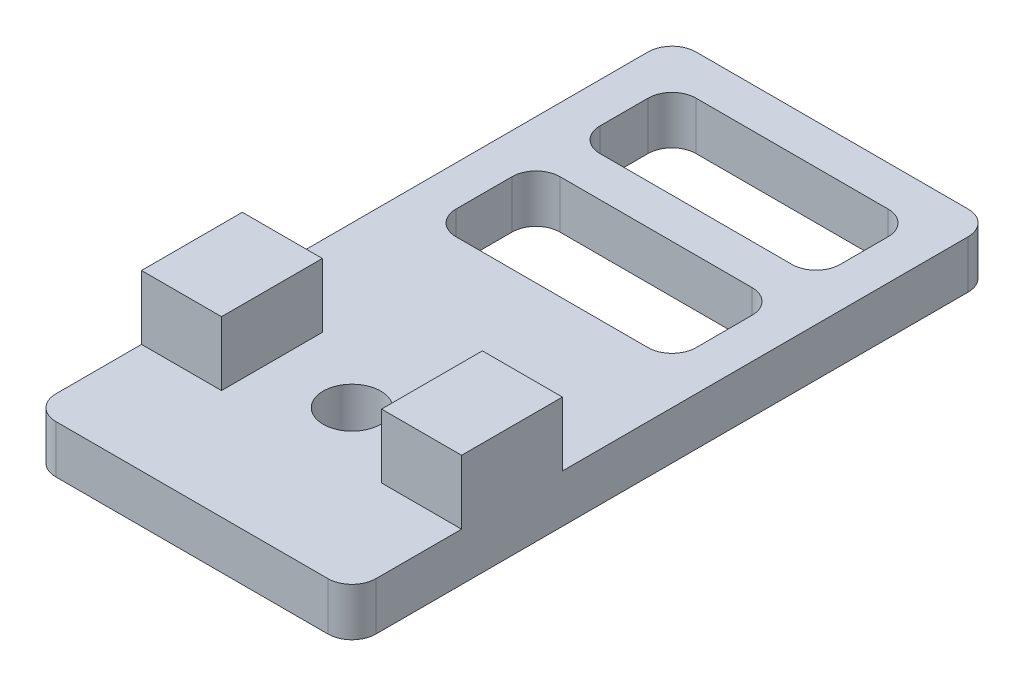
ISO-10303-21;
HEADER;
FILE_DESCRIPTION(('STEP AP214'),'2;1');
FILE_NAME('part.step','',(''),(''),'','','');
FILE_SCHEMA(('AUTOMOTIVE_DESIGN { 1 0 10303 214 1 1 1 1 }'));
ENDSEC;
DATA;
#1=APPLICATION_CONTEXT('core data for automotive mechanical design processes');
#2=APPLICATION_PROTOCOL_DEFINITION('international standard','automotive_design',2000,#1);
#3=PRODUCT_CONTEXT('',#1,'mechanical');
#4=PRODUCT('Part','Part','',(#3));
#5=PRODUCT_RELATED_PRODUCT_CATEGORY('part','',(#4));
#6=PRODUCT_DEFINITION_FORMATION('','',#4);
#7=PRODUCT_DEFINITION_CONTEXT('part definition',#1,'design');
#8=PRODUCT_DEFINITION('design','',#6,#7);
#9=PRODUCT_DEFINITION_SHAPE('','',#8);
#10=(LENGTH_UNIT() NAMED_UNIT(*) SI_UNIT(.MILLI.,.METRE.));
#11=(NAMED_UNIT(*) PLANE_ANGLE_UNIT() SI_UNIT($,.RADIAN.));
#12=(NAMED_UNIT(*) SI_UNIT($,.STERADIAN.) SOLID_ANGLE_UNIT());
#13=UNCERTAINTY_MEASURE_WITH_UNIT(LENGTH_MEASURE(1.E-05),#10,'distance_accuracy_value','');
#14=(GEOMETRIC_REPRESENTATION_CONTEXT(3) GLOBAL_UNCERTAINTY_ASSIGNED_CONTEXT((#13)) GLOBAL_UNIT_ASSIGNED_CONTEXT((#10,
#11,#12)) REPRESENTATION_CONTEXT('',''));
#15=CARTESIAN_POINT('',(0.,0.,0.));
#16=DIRECTION('',(0.,0.,1.));
#17=DIRECTION('',(1.,0.,0.));
#18=AXIS2_PLACEMENT_3D('',#15,#16,#17);
#19=CARTESIAN_POINT('',(17.5,3.,0.));
#20=DIRECTION('',(1.,0.,0.));
#21=DIRECTION('',(0.,0.,-1.));
#22=AXIS2_PLACEMENT_3D('',#19,#20,#21);
#23=PLANE('',#22);
#24=DIRECTION('',(0.,0.,1.));
#25=VECTOR('',#24,1.);
#26=CARTESIAN_POINT('',(17.5,0.,0.));
#27=LINE('',#26,#25);
#28=CARTESIAN_POINT('',(17.5,0.,-36.));
#29=VERTEX_POINT('',#28);
#30=CARTESIAN_POINT('',(17.5,0.,-33.));
#31=VERTEX_POINT('',#30);
#32=EDGE_CURVE('E395',#29,#31,#27,.T.);
#33=ORIENTED_EDGE('',*,*,#32,.T.);
#34=DIRECTION('',(0.,1.,0.));
#35=VECTOR('',#34,1.);
#36=CARTESIAN_POINT('',(17.5,3.,-33.));
#37=LINE('',#36,#35);
#38=CARTESIAN_POINT('',(17.5,3.,-33.));
#39=VERTEX_POINT('',#38);
#40=EDGE_CURVE('E436',#31,#39,#37,.T.);
#41=ORIENTED_EDGE('',*,*,#40,.T.);
#42=DIRECTION('',(0.,0.,1.));
#43=VECTOR('',#42,1.);
#44=CARTESIAN_POINT('',(17.5,3.,0.));
#45=LINE('',#44,#43);
#46=CARTESIAN_POINT('',(17.5,3.,-36.));
#47=VERTEX_POINT('',#46);
#48=EDGE_CURVE('E367',#47,#39,#45,.T.);
#49=ORIENTED_EDGE('',*,*,#48,.F.);
#50=DIRECTION('',(0.,-1.,0.));
#51=VECTOR('',#50,1.);
#52=CARTESIAN_POINT('',(17.5,0.,-36.));
#53=LINE('',#52,#51);
#54=EDGE_CURVE('E433',#47,#29,#53,.T.);
#55=ORIENTED_EDGE('',*,*,#54,.T.);
#56=EDGE_LOOP('',(#33,#41,#49,#55));
#57=FACE_BOUND('',#56,.T.);
#58=ADVANCED_FACE('F65',(#57),#23,.F.);
#59=CARTESIAN_POINT('',(17.5,3.,-27.5));
#60=VERTEX_POINT('',#59);
#61=CARTESIAN_POINT('',(17.5,3.,-24.));
#62=VERTEX_POINT('',#61);
#63=EDGE_CURVE('E366',#60,#62,#45,.T.);
#64=ORIENTED_EDGE('',*,*,#63,.F.);
#65=DIRECTION('',(0.,1.,0.));
#66=VECTOR('',#65,1.);
#67=CARTESIAN_POINT('',(17.5,0.,-27.5));
#68=LINE('',#67,#66);
#69=CARTESIAN_POINT('',(17.5,0.,-27.5));
#70=VERTEX_POINT('',#69);
#71=EDGE_CURVE('E431',#60,#70,#68,.F.);
#72=ORIENTED_EDGE('',*,*,#71,.T.);
#73=CARTESIAN_POINT('',(17.5,0.,-24.));
#74=VERTEX_POINT('',#73);
#75=EDGE_CURVE('E394',#70,#74,#27,.T.);
#76=ORIENTED_EDGE('',*,*,#75,.T.);
#77=DIRECTION('',(0.,-1.,0.));
#78=VECTOR('',#77,1.);
#79=CARTESIAN_POINT('',(17.5,3.,-24.));
#80=LINE('',#79,#78);
#81=EDGE_CURVE('E429',#74,#62,#80,.F.);
#82=ORIENTED_EDGE('',*,*,#81,.T.);
#83=EDGE_LOOP('',(#64,#72,#76,#82));
#84=FACE_BOUND('',#83,.T.);
#85=ADVANCED_FACE('F563',(#84),#23,.F.);
#86=CARTESIAN_POINT('',(0.,3.,-22.5));
#87=DIRECTION('',(0.,0.,-1.));
#88=DIRECTION('',(-1.,0.,0.));
#89=AXIS2_PLACEMENT_3D('',#86,#87,#88);
#90=PLANE('',#89);
#91=DIRECTION('',(1.,0.,0.));
#92=VECTOR('',#91,1.);
#93=CARTESIAN_POINT('',(0.,0.,-22.5));
#94=LINE('',#93,#92);
#95=CARTESIAN_POINT('',(4.,0.,-22.5));
#96=VERTEX_POINT('',#95);
#97=CARTESIAN_POINT('',(16.,0.,-22.5));
#98=VERTEX_POINT('',#97);
#99=EDGE_CURVE('E398',#96,#98,#94,.T.);
#100=ORIENTED_EDGE('',*,*,#99,.F.);
#101=DIRECTION('',(0.,-1.,0.));
#102=VECTOR('',#101,1.);
#103=CARTESIAN_POINT('',(4.,3.,-22.5));
#104=LINE('',#103,#102);
#105=CARTESIAN_POINT('',(4.,3.,-22.5));
#106=VERTEX_POINT('',#105);
#107=EDGE_CURVE('E422',#96,#106,#104,.F.);
#108=ORIENTED_EDGE('',*,*,#107,.T.);
#109=DIRECTION('',(1.,0.,0.));
#110=VECTOR('',#109,1.);
#111=CARTESIAN_POINT('',(0.,3.,-22.5));
#112=LINE('',#111,#110);
#113=CARTESIAN_POINT('',(16.,3.,-22.5));
#114=VERTEX_POINT('',#113);
#115=EDGE_CURVE('E370',#106,#114,#112,.T.);
#116=ORIENTED_EDGE('',*,*,#115,.T.);
#117=DIRECTION('',(0.,-1.,0.));
#118=VECTOR('',#117,1.);
#119=CARTESIAN_POINT('',(16.,3.,-22.5));
#120=LINE('',#119,#118);
#121=EDGE_CURVE('E419',#114,#98,#120,.T.);
#122=ORIENTED_EDGE('',*,*,#121,.T.);
#123=EDGE_LOOP('',(#100,#108,#116,#122));
#124=FACE_BOUND('',#123,.T.);
#125=ADVANCED_FACE('F569',(#124),#90,.T.);
#126=CARTESIAN_POINT('',(2.5,3.,0.));
#127=DIRECTION('',(1.,0.,0.));
#128=DIRECTION('',(0.,0.,-1.));
#129=AXIS2_PLACEMENT_3D('',#126,#127,#128);
#130=PLANE('',#129);
#131=DIRECTION('',(0.,0.,1.));
#132=VECTOR('',#131,1.);
#133=CARTESIAN_POINT('',(2.5,3.,0.));
#134=LINE('',#133,#132);
#135=CARTESIAN_POINT('',(2.5,3.,-27.5));
#136=VERTEX_POINT('',#135);
#137=CARTESIAN_POINT('',(2.5,3.,-24.));
#138=VERTEX_POINT('',#137);
#139=EDGE_CURVE('E373',#136,#138,#134,.T.);
#140=ORIENTED_EDGE('',*,*,#139,.T.);
#141=DIRECTION('',(0.,-1.,0.));
#142=VECTOR('',#141,1.);
#143=CARTESIAN_POINT('',(2.5,0.,-24.));
#144=LINE('',#143,#142);
#145=CARTESIAN_POINT('',(2.5,0.,-24.));
#146=VERTEX_POINT('',#145);
#147=EDGE_CURVE('E416',#138,#146,#144,.T.);
#148=ORIENTED_EDGE('',*,*,#147,.T.);
#149=DIRECTION('',(0.,0.,1.));
#150=VECTOR('',#149,1.);
#151=CARTESIAN_POINT('',(2.5,0.,0.));
#152=LINE('',#151,#150);
#153=CARTESIAN_POINT('',(2.5,0.,-27.5));
#154=VERTEX_POINT('',#153);
#155=EDGE_CURVE('E401',#154,#146,#152,.T.);
#156=ORIENTED_EDGE('',*,*,#155,.F.);
#157=DIRECTION('',(0.,1.,0.));
#158=VECTOR('',#157,1.);
#159=CARTESIAN_POINT('',(2.5,3.,-27.5));
#160=LINE('',#159,#158);
#161=EDGE_CURVE('E377',#154,#136,#160,.T.);
#162=ORIENTED_EDGE('',*,*,#161,.T.);
#163=EDGE_LOOP('',(#140,#148,#156,#162));
#164=FACE_BOUND('',#163,.T.);
#165=ADVANCED_FACE('F729',(#164),#130,.T.);
#166=CARTESIAN_POINT('',(2.5,3.,-36.));
#167=VERTEX_POINT('',#166);
#168=CARTESIAN_POINT('',(2.5,3.,-33.));
#169=VERTEX_POINT('',#168);
#170=EDGE_CURVE('E374',#167,#169,#134,.T.);
#171=ORIENTED_EDGE('',*,*,#170,.T.);
#172=DIRECTION('',(0.,1.,0.));
#173=VECTOR('',#172,1.);
#174=CARTESIAN_POINT('',(2.5,0.,-33.));
#175=LINE('',#174,#173);
#176=CARTESIAN_POINT('',(2.5,0.,-33.));
#177=VERTEX_POINT('',#176);
#178=EDGE_CURVE('E446',#169,#177,#175,.F.);
#179=ORIENTED_EDGE('',*,*,#178,.T.);
#180=CARTESIAN_POINT('',(2.5,0.,-36.));
#181=VERTEX_POINT('',#180);
#182=EDGE_CURVE('E354',#181,#177,#152,.T.);
#183=ORIENTED_EDGE('',*,*,#182,.F.);
#184=DIRECTION('',(0.,-1.,0.));
#185=VECTOR('',#184,1.);
#186=CARTESIAN_POINT('',(2.5,3.,-36.));
#187=LINE('',#186,#185);
#188=EDGE_CURVE('E444',#181,#167,#187,.F.);
#189=ORIENTED_EDGE('',*,*,#188,.T.);
#190=EDGE_LOOP('',(#171,#179,#183,#189));
#191=FACE_BOUND('',#190,.T.);
#192=ADVANCED_FACE('F548',(#191),#130,.T.);
#193=CARTESIAN_POINT('',(0.,3.,-37.5));
#194=DIRECTION('',(0.,0.,-1.));
#195=DIRECTION('',(-1.,0.,0.));
#196=AXIS2_PLACEMENT_3D('',#193,#194,#195);
#197=PLANE('',#196);
#198=DIRECTION('',(1.,0.,0.));
#199=VECTOR('',#198,1.);
#200=CARTESIAN_POINT('',(0.,3.,-37.5));
#201=LINE('',#200,#199);
#202=CARTESIAN_POINT('',(4.,3.,-37.5));
#203=VERTEX_POINT('',#202);
#204=CARTESIAN_POINT('',(16.,3.,-37.5));
#205=VERTEX_POINT('',#204);
#206=EDGE_CURVE('E363',#203,#205,#201,.T.);
#207=ORIENTED_EDGE('',*,*,#206,.F.);
#208=DIRECTION('',(0.,-1.,0.));
#209=VECTOR('',#208,1.);
#210=CARTESIAN_POINT('',(4.,3.,-37.5));
#211=LINE('',#210,#209);
#212=CARTESIAN_POINT('',(4.,0.,-37.5));
#213=VERTEX_POINT('',#212);
#214=EDGE_CURVE('E450',#203,#213,#211,.T.);
#215=ORIENTED_EDGE('',*,*,#214,.T.);
#216=DIRECTION('',(1.,0.,0.));
#217=VECTOR('',#216,1.);
#218=CARTESIAN_POINT('',(0.,0.,-37.5));
#219=LINE('',#218,#217);
#220=CARTESIAN_POINT('',(16.,0.,-37.5));
#221=VERTEX_POINT('',#220);
#222=EDGE_CURVE('E391',#213,#221,#219,.T.);
#223=ORIENTED_EDGE('',*,*,#222,.T.);
#224=DIRECTION('',(0.,-1.,0.));
#225=VECTOR('',#224,1.);
#226=CARTESIAN_POINT('',(16.,3.,-37.5));
#227=LINE('',#226,#225);
#228=EDGE_CURVE('E448',#221,#205,#227,.F.);
#229=ORIENTED_EDGE('',*,*,#228,.T.);
#230=EDGE_LOOP('',(#207,#215,#223,#229));
#231=FACE_BOUND('',#230,.T.);
#232=ADVANCED_FACE('F523',(#231),#197,.F.);
#233=CARTESIAN_POINT('',(20.,3.,0.));
#234=DIRECTION('',(-1.,0.,0.));
#235=DIRECTION('',(0.,0.,1.));
#236=AXIS2_PLACEMENT_3D('',#233,#234,#235);
#237=PLANE('',#236);
#238=DIRECTION('',(0.,0.,-1.));
#239=VECTOR('',#238,1.);
#240=CARTESIAN_POINT('',(20.,3.,0.));
#241=LINE('',#240,#239);
#242=CARTESIAN_POINT('',(20.,3.,-1.5));
#243=VERTEX_POINT('',#242);
#244=CARTESIAN_POINT('',(20.,3.,-6.85));
#245=VERTEX_POINT('',#244);
#246=EDGE_CURVE('E355',#243,#245,#241,.T.);
#247=ORIENTED_EDGE('',*,*,#246,.F.);
#248=DIRECTION('',(0.,-1.,0.));
#249=VECTOR('',#248,1.);
#250=CARTESIAN_POINT('',(20.,3.,-1.5));
#251=LINE('',#250,#249);
#252=CARTESIAN_POINT('',(20.,0.,-1.5));
#253=VERTEX_POINT('',#252);
#254=EDGE_CURVE('E455',#243,#253,#251,.T.);
#255=ORIENTED_EDGE('',*,*,#254,.T.);
#256=DIRECTION('',(0.,0.,-1.));
#257=VECTOR('',#256,1.);
#258=CARTESIAN_POINT('',(20.,0.,0.));
#259=LINE('',#258,#257);
#260=CARTESIAN_POINT('',(20.,0.,-38.5));
#261=VERTEX_POINT('',#260);
#262=EDGE_CURVE('E381',#253,#261,#259,.T.);
#263=ORIENTED_EDGE('',*,*,#262,.T.);
#264=DIRECTION('',(0.,-1.,0.));
#265=VECTOR('',#264,1.);
#266=CARTESIAN_POINT('',(20.,3.,-38.5));
#267=LINE('',#266,#265);
#268=CARTESIAN_POINT('',(20.,3.,-38.5));
#269=VERTEX_POINT('',#268);
#270=EDGE_CURVE('E453',#261,#269,#267,.F.);
#271=ORIENTED_EDGE('',*,*,#270,.T.);
#272=CARTESIAN_POINT('',(20.,3.,-13.15));
#273=VERTEX_POINT('',#272);
#274=EDGE_CURVE('E353',#273,#269,#241,.T.);
#275=ORIENTED_EDGE('',*,*,#274,.F.);
#276=DIRECTION('',(0.,-1.,0.));
#277=VECTOR('',#276,1.);
#278=CARTESIAN_POINT('',(20.,7.,-13.15));
#279=LINE('',#278,#277);
#280=CARTESIAN_POINT('',(20.,7.,-13.15));
#281=VERTEX_POINT('',#280);
#282=EDGE_CURVE('E313',#281,#273,#279,.T.);
#283=ORIENTED_EDGE('',*,*,#282,.F.);
#284=DIRECTION('',(0.,0.,-1.));
#285=VECTOR('',#284,1.);
#286=CARTESIAN_POINT('',(20.,7.,0.));
#287=LINE('',#286,#285);
#288=CARTESIAN_POINT('',(20.,7.,-6.85));
#289=VERTEX_POINT('',#288);
#290=EDGE_CURVE('E300',#289,#281,#287,.T.);
#291=ORIENTED_EDGE('',*,*,#290,.F.);
#292=DIRECTION('',(0.,-1.,0.));
#293=VECTOR('',#292,1.);
#294=CARTESIAN_POINT('',(20.,7.,-6.85));
#295=LINE('',#294,#293);
#296=EDGE_CURVE('E317',#289,#245,#295,.T.);
#297=ORIENTED_EDGE('',*,*,#296,.T.);
#298=EDGE_LOOP('',(#247,#255,#263,#271,#275,#283,#291,#297));
#299=FACE_BOUND('',#298,.T.);
#300=ADVANCED_FACE('F576',(#299),#237,.F.);
#301=CARTESIAN_POINT('',(0.,3.,-40.));
#302=DIRECTION('',(0.,0.,-1.));
#303=DIRECTION('',(-1.,0.,0.));
#304=AXIS2_PLACEMENT_3D('',#301,#302,#303);
#305=PLANE('',#304);
#306=DIRECTION('',(1.,0.,0.));
#307=VECTOR('',#306,1.);
#308=CARTESIAN_POINT('',(0.,0.,-40.));
#309=LINE('',#308,#307);
#310=CARTESIAN_POINT('',(1.49999999999999,0.,-40.));
#311=VERTEX_POINT('',#310);
#312=CARTESIAN_POINT('',(18.5,0.,-40.));
#313=VERTEX_POINT('',#312);
#314=EDGE_CURVE('E385',#311,#313,#309,.T.);
#315=ORIENTED_EDGE('',*,*,#314,.F.);
#316=DIRECTION('',(0.,-1.,0.));
#317=VECTOR('',#316,1.);
#318=CARTESIAN_POINT('',(1.49999999999999,3.,-40.));
#319=LINE('',#318,#317);
#320=CARTESIAN_POINT('',(1.49999999999999,3.,-40.));
#321=VERTEX_POINT('',#320);
#322=EDGE_CURVE('E485',#311,#321,#319,.F.);
#323=ORIENTED_EDGE('',*,*,#322,.T.);
#324=DIRECTION('',(1.,0.,0.));
#325=VECTOR('',#324,1.);
#326=CARTESIAN_POINT('',(0.,3.,-40.));
#327=LINE('',#326,#325);
#328=CARTESIAN_POINT('',(18.5,3.,-40.));
#329=VERTEX_POINT('',#328);
#330=EDGE_CURVE('E357',#321,#329,#327,.T.);
#331=ORIENTED_EDGE('',*,*,#330,.T.);
#332=DIRECTION('',(0.,-1.,0.));
#333=VECTOR('',#332,1.);
#334=CARTESIAN_POINT('',(18.5,0.,-40.));
#335=LINE('',#334,#333);
#336=EDGE_CURVE('E482',#329,#313,#335,.T.);
#337=ORIENTED_EDGE('',*,*,#336,.T.);
#338=EDGE_LOOP('',(#315,#323,#331,#337));
#339=FACE_BOUND('',#338,.T.);
#340=ADVANCED_FACE('F581',(#339),#305,.T.);
#341=CARTESIAN_POINT('',(0.,3.,0.));
#342=DIRECTION('',(-1.,0.,0.));
#343=DIRECTION('',(0.,0.,1.));
#344=AXIS2_PLACEMENT_3D('',#341,#342,#343);
#345=PLANE('',#344);
#346=DIRECTION('',(0.,0.,-1.));
#347=VECTOR('',#346,1.);
#348=CARTESIAN_POINT('',(0.,0.,0.));
#349=LINE('',#348,#347);
#350=CARTESIAN_POINT('',(0.,0.,-1.5));
#351=VERTEX_POINT('',#350);
#352=CARTESIAN_POINT('',(0.,0.,-38.5));
#353=VERTEX_POINT('',#352);
#354=EDGE_CURVE('E388',#351,#353,#349,.T.);
#355=ORIENTED_EDGE('',*,*,#354,.F.);
#356=DIRECTION('',(0.,-1.,0.));
#357=VECTOR('',#356,1.);
#358=CARTESIAN_POINT('',(0.,3.,-1.5));
#359=LINE('',#358,#357);
#360=CARTESIAN_POINT('',(0.,3.,-1.5));
#361=VERTEX_POINT('',#360);
#362=EDGE_CURVE('E80',#351,#361,#359,.F.);
#363=ORIENTED_EDGE('',*,*,#362,.T.);
#364=DIRECTION('',(0.,0.,-1.));
#365=VECTOR('',#364,1.);
#366=CARTESIAN_POINT('',(0.,3.,0.));
#367=LINE('',#366,#365);
#368=CARTESIAN_POINT('',(0.,3.,-6.85));
#369=VERTEX_POINT('',#368);
#370=EDGE_CURVE('E361',#361,#369,#367,.T.);
#371=ORIENTED_EDGE('',*,*,#370,.T.);
#372=DIRECTION('',(0.,-1.,0.));
#373=VECTOR('',#372,1.);
#374=CARTESIAN_POINT('',(0.,7.,-6.85));
#375=LINE('',#374,#373);
#376=CARTESIAN_POINT('',(0.,7.,-6.85));
#377=VERTEX_POINT('',#376);
#378=EDGE_CURVE('E341',#377,#369,#375,.T.);
#379=ORIENTED_EDGE('',*,*,#378,.F.);
#380=DIRECTION('',(0.,0.,1.));
#381=VECTOR('',#380,1.);
#382=CARTESIAN_POINT('',(0.,7.,0.));
#383=LINE('',#382,#381);
#384=CARTESIAN_POINT('',(0.,7.,-13.15));
#385=VERTEX_POINT('',#384);
#386=EDGE_CURVE('E328',#385,#377,#383,.T.);
#387=ORIENTED_EDGE('',*,*,#386,.F.);
#388=DIRECTION('',(0.,-1.,0.));
#389=VECTOR('',#388,1.);
#390=CARTESIAN_POINT('',(0.,7.,-13.15));
#391=LINE('',#390,#389);
#392=CARTESIAN_POINT('',(0.,3.,-13.15));
#393=VERTEX_POINT('',#392);
#394=EDGE_CURVE('E344',#385,#393,#391,.T.);
#395=ORIENTED_EDGE('',*,*,#394,.T.);
#396=CARTESIAN_POINT('',(0.,3.,-38.5));
#397=VERTEX_POINT('',#396);
#398=EDGE_CURVE('E360',#393,#397,#367,.T.);
#399=ORIENTED_EDGE('',*,*,#398,.T.);
#400=DIRECTION('',(0.,-1.,0.));
#401=VECTOR('',#400,1.);
#402=CARTESIAN_POINT('',(0.,3.,-38.5));
#403=LINE('',#402,#401);
#404=EDGE_CURVE('E478',#397,#353,#403,.T.);
#405=ORIENTED_EDGE('',*,*,#404,.T.);
#406=EDGE_LOOP('',(#355,#363,#371,#379,#387,#395,#399,#405));
#407=FACE_BOUND('',#406,.T.);
#408=ADVANCED_FACE('F577',(#407),#345,.T.);
#409=CARTESIAN_POINT('',(0.,3.,0.));
#410=DIRECTION('',(0.,0.,-1.));
#411=DIRECTION('',(-1.,0.,0.));
#412=AXIS2_PLACEMENT_3D('',#409,#410,#411);
#413=PLANE('',#412);
#414=DIRECTION('',(1.,0.,0.));
#415=VECTOR('',#414,1.);
#416=CARTESIAN_POINT('',(0.,0.,0.));
#417=LINE('',#416,#415);
#418=CARTESIAN_POINT('',(1.5,0.,0.));
#419=VERTEX_POINT('',#418);
#420=CARTESIAN_POINT('',(18.5,0.,0.));
#421=VERTEX_POINT('',#420);
#422=EDGE_CURVE('E378',#419,#421,#417,.T.);
#423=ORIENTED_EDGE('',*,*,#422,.T.);
#424=DIRECTION('',(0.,-1.,0.));
#425=VECTOR('',#424,1.);
#426=CARTESIAN_POINT('',(18.5,3.,0.));
#427=LINE('',#426,#425);
#428=CARTESIAN_POINT('',(18.5,3.,0.));
#429=VERTEX_POINT('',#428);
#430=EDGE_CURVE('E469',#421,#429,#427,.F.);
#431=ORIENTED_EDGE('',*,*,#430,.T.);
#432=DIRECTION('',(1.,0.,0.));
#433=VECTOR('',#432,1.);
#434=CARTESIAN_POINT('',(0.,3.,0.));
#435=LINE('',#434,#433);
#436=CARTESIAN_POINT('',(1.5,3.,0.));
#437=VERTEX_POINT('',#436);
#438=EDGE_CURVE('E350',#437,#429,#435,.T.);
#439=ORIENTED_EDGE('',*,*,#438,.F.);
#440=DIRECTION('',(0.,-1.,0.));
#441=VECTOR('',#440,1.);
#442=CARTESIAN_POINT('',(1.5,0.,0.));
#443=LINE('',#442,#441);
#444=EDGE_CURVE('E466',#437,#419,#443,.T.);
#445=ORIENTED_EDGE('',*,*,#444,.T.);
#446=EDGE_LOOP('',(#423,#431,#439,#445));
#447=FACE_BOUND('',#446,.T.);
#448=ADVANCED_FACE('F580',(#447),#413,.F.);
#449=CARTESIAN_POINT('',(0.,0.,0.));
#450=DIRECTION('',(0.,1.,0.));
#451=DIRECTION('',(0.,0.,1.));
#452=AXIS2_PLACEMENT_3D('',#449,#450,#451);
#453=PLANE('',#452);
#454=CARTESIAN_POINT('',(10.,0.,-10.));
#455=DIRECTION('',(0.,1.,0.));
#456=DIRECTION('',(0.,0.,1.));
#457=AXIS2_PLACEMENT_3D('',#454,#455,#456);
#458=CIRCLE('',#457,1.8);
#459=CARTESIAN_POINT('',(10.,0.,-8.2));
#460=VERTEX_POINT('',#459);
#461=EDGE_CURVE('E308',#460,#460,#458,.T.);
#462=ORIENTED_EDGE('',*,*,#461,.T.);
#463=EDGE_LOOP('',(#462));
#464=FACE_BOUND('',#463,.T.);
#465=ORIENTED_EDGE('',*,*,#75,.F.);
#466=CARTESIAN_POINT('',(16.,0.,-27.5));
#467=DIRECTION('',(0.,1.,0.));
#468=DIRECTION('',(0.,0.,1.));
#469=AXIS2_PLACEMENT_3D('',#466,#467,#468);
#470=CIRCLE('',#469,1.5);
#471=CARTESIAN_POINT('',(16.,0.,-29.));
#472=VERTEX_POINT('',#471);
#473=EDGE_CURVE('E497',#70,#472,#470,.T.);
#474=ORIENTED_EDGE('',*,*,#473,.T.);
#475=DIRECTION('',(1.,0.,0.));
#476=VECTOR('',#475,1.);
#477=CARTESIAN_POINT('',(2.5,0.,-29.));
#478=LINE('',#477,#476);
#479=CARTESIAN_POINT('',(4.,0.,-29.));
#480=VERTEX_POINT('',#479);
#481=EDGE_CURVE('E349',#480,#472,#478,.T.);
#482=ORIENTED_EDGE('',*,*,#481,.F.);
#483=CARTESIAN_POINT('',(4.,0.,-27.5));
#484=DIRECTION('',(0.,1.,0.));
#485=DIRECTION('',(0.,0.,1.));
#486=AXIS2_PLACEMENT_3D('',#483,#484,#485);
#487=CIRCLE('',#486,1.5);
#488=EDGE_CURVE('E493',#480,#154,#487,.T.);
#489=ORIENTED_EDGE('',*,*,#488,.T.);
#490=ORIENTED_EDGE('',*,*,#155,.T.);
#491=CARTESIAN_POINT('',(4.,0.,-24.));
#492=DIRECTION('',(0.,1.,0.));
#493=DIRECTION('',(0.,0.,1.));
#494=AXIS2_PLACEMENT_3D('',#491,#492,#493);
#495=CIRCLE('',#494,1.5);
#496=EDGE_CURVE('E487',#146,#96,#495,.T.);
#497=ORIENTED_EDGE('',*,*,#496,.T.);
#498=ORIENTED_EDGE('',*,*,#99,.T.);
#499=CARTESIAN_POINT('',(16.,0.,-24.));
#500=DIRECTION('',(0.,1.,0.));
#501=DIRECTION('',(0.,0.,1.));
#502=AXIS2_PLACEMENT_3D('',#499,#500,#501);
#503=CIRCLE('',#502,1.5);
#504=EDGE_CURVE('E499',#98,#74,#503,.T.);
#505=ORIENTED_EDGE('',*,*,#504,.T.);
#506=EDGE_LOOP('',(#465,#474,#482,#489,#490,#497,#498,#505));
#507=FACE_BOUND('',#506,.T.);
#508=ORIENTED_EDGE('',*,*,#262,.F.);
#509=CARTESIAN_POINT('',(18.5,0.,-1.5));
#510=DIRECTION('',(0.,1.,0.));
#511=DIRECTION('',(0.,0.,1.));
#512=AXIS2_PLACEMENT_3D('',#509,#510,#511);
#513=CIRCLE('',#512,1.5);
#514=EDGE_CURVE('E464',#253,#421,#513,.F.);
#515=ORIENTED_EDGE('',*,*,#514,.T.);
#516=ORIENTED_EDGE('',*,*,#422,.F.);
#517=CARTESIAN_POINT('',(1.5,0.,-1.5));
#518=DIRECTION('',(0.,1.,0.));
#519=DIRECTION('',(0.,0.,1.));
#520=AXIS2_PLACEMENT_3D('',#517,#518,#519);
#521=CIRCLE('',#520,1.5);
#522=EDGE_CURVE('E462',#419,#351,#521,.F.);
#523=ORIENTED_EDGE('',*,*,#522,.T.);
#524=ORIENTED_EDGE('',*,*,#354,.T.);
#525=CARTESIAN_POINT('',(1.49999999999999,0.,-38.5));
#526=DIRECTION('',(0.,1.,0.));
#527=DIRECTION('',(0.,0.,1.));
#528=AXIS2_PLACEMENT_3D('',#525,#526,#527);
#529=CIRCLE('',#528,1.5);
#530=EDGE_CURVE('E460',#353,#311,#529,.F.);
#531=ORIENTED_EDGE('',*,*,#530,.T.);
#532=ORIENTED_EDGE('',*,*,#314,.T.);
#533=CARTESIAN_POINT('',(18.5,0.,-38.5));
#534=DIRECTION('',(0.,1.,0.));
#535=DIRECTION('',(0.,0.,1.));
#536=AXIS2_PLACEMENT_3D('',#533,#534,#535);
#537=CIRCLE('',#536,1.5);
#538=EDGE_CURVE('E458',#313,#261,#537,.F.);
#539=ORIENTED_EDGE('',*,*,#538,.T.);
#540=EDGE_LOOP('',(#508,#515,#516,#523,#524,#531,#532,#539));
#541=FACE_BOUND('',#540,.T.);
#542=ORIENTED_EDGE('',*,*,#222,.F.);
#543=CARTESIAN_POINT('',(4.,0.,-36.));
#544=DIRECTION('',(0.,1.,0.));
#545=DIRECTION('',(0.,0.,1.));
#546=AXIS2_PLACEMENT_3D('',#543,#544,#545);
#547=CIRCLE('',#546,1.5);
#548=EDGE_CURVE('E511',#213,#181,#547,.T.);
#549=ORIENTED_EDGE('',*,*,#548,.T.);
#550=ORIENTED_EDGE('',*,*,#182,.T.);
#551=CARTESIAN_POINT('',(4.,0.,-33.));
#552=DIRECTION('',(0.,1.,0.));
#553=DIRECTION('',(0.,0.,1.));
#554=AXIS2_PLACEMENT_3D('',#551,#552,#553);
#555=CIRCLE('',#554,1.5);
#556=CARTESIAN_POINT('',(4.,0.,-31.5));
#557=VERTEX_POINT('',#556);
#558=EDGE_CURVE('E509',#177,#557,#555,.T.);
#559=ORIENTED_EDGE('',*,*,#558,.T.);
#560=DIRECTION('',(1.,0.,0.));
#561=VECTOR('',#560,1.);
#562=CARTESIAN_POINT('',(2.5,0.,-31.5));
#563=LINE('',#562,#561);
#564=CARTESIAN_POINT('',(16.,0.,-31.5));
#565=VERTEX_POINT('',#564);
#566=EDGE_CURVE('E407',#557,#565,#563,.T.);
#567=ORIENTED_EDGE('',*,*,#566,.T.);
#568=CARTESIAN_POINT('',(16.,0.,-33.));
#569=DIRECTION('',(0.,1.,0.));
#570=DIRECTION('',(0.,0.,1.));
#571=AXIS2_PLACEMENT_3D('',#568,#569,#570);
#572=CIRCLE('',#571,1.5);
#573=EDGE_CURVE('E505',#565,#31,#572,.T.);
#574=ORIENTED_EDGE('',*,*,#573,.T.);
#575=ORIENTED_EDGE('',*,*,#32,.F.);
#576=CARTESIAN_POINT('',(16.,0.,-36.));
#577=DIRECTION('',(0.,1.,0.));
#578=DIRECTION('',(0.,0.,1.));
#579=AXIS2_PLACEMENT_3D('',#576,#577,#578);
#580=CIRCLE('',#579,1.5);
#581=EDGE_CURVE('E73',#29,#221,#580,.T.);
#582=ORIENTED_EDGE('',*,*,#581,.T.);
#583=EDGE_LOOP('',(#542,#549,#550,#559,#567,#574,#575,#582));
#584=FACE_BOUND('',#583,.T.);
#585=ADVANCED_FACE('F517',(#464,#507,#541,#584),#453,.F.);
#586=CARTESIAN_POINT('',(0.,3.,0.));
#587=DIRECTION('',(0.,1.,0.));
#588=DIRECTION('',(0.,0.,1.));
#589=AXIS2_PLACEMENT_3D('',#586,#587,#588);
#590=PLANE('',#589);
#591=CARTESIAN_POINT('',(10.,3.,-10.));
#592=DIRECTION('',(0.,1.,0.));
#593=DIRECTION('',(0.,0.,1.));
#594=AXIS2_PLACEMENT_3D('',#591,#592,#593);
#595=CIRCLE('',#594,1.8);
#596=CARTESIAN_POINT('',(10.,3.,-8.2));
#597=VERTEX_POINT('',#596);
#598=EDGE_CURVE('E934',#597,#597,#595,.T.);
#599=ORIENTED_EDGE('',*,*,#598,.F.);
#600=EDGE_LOOP('',(#599));
#601=FACE_BOUND('',#600,.T.);
#602=ORIENTED_EDGE('',*,*,#438,.T.);
#603=CARTESIAN_POINT('',(18.5,3.,-1.5));
#604=DIRECTION('',(0.,1.,0.));
#605=DIRECTION('',(0.,0.,1.));
#606=AXIS2_PLACEMENT_3D('',#603,#604,#605);
#607=CIRCLE('',#606,1.5);
#608=EDGE_CURVE('E476',#429,#243,#607,.T.);
#609=ORIENTED_EDGE('',*,*,#608,.T.);
#610=ORIENTED_EDGE('',*,*,#246,.T.);
#611=DIRECTION('',(1.,0.,0.));
#612=VECTOR('',#611,1.);
#613=CARTESIAN_POINT('',(0.,3.,-6.85));
#614=LINE('',#613,#612);
#615=CARTESIAN_POINT('',(15.,3.,-6.85));
#616=VERTEX_POINT('',#615);
#617=EDGE_CURVE('E302',#616,#245,#614,.T.);
#618=ORIENTED_EDGE('',*,*,#617,.F.);
#619=DIRECTION('',(0.,0.,1.));
#620=VECTOR('',#619,1.);
#621=CARTESIAN_POINT('',(15.,3.,0.));
#622=LINE('',#621,#620);
#623=CARTESIAN_POINT('',(15.,3.,-13.15));
#624=VERTEX_POINT('',#623);
#625=EDGE_CURVE('E305',#624,#616,#622,.T.);
#626=ORIENTED_EDGE('',*,*,#625,.F.);
#627=DIRECTION('',(1.,0.,0.));
#628=VECTOR('',#627,1.);
#629=CARTESIAN_POINT('',(0.,3.,-13.15));
#630=LINE('',#629,#628);
#631=EDGE_CURVE('E284',#624,#273,#630,.T.);
#632=ORIENTED_EDGE('',*,*,#631,.T.);
#633=ORIENTED_EDGE('',*,*,#274,.T.);
#634=CARTESIAN_POINT('',(18.5,3.,-38.5));
#635=DIRECTION('',(0.,1.,0.));
#636=DIRECTION('',(0.,0.,1.));
#637=AXIS2_PLACEMENT_3D('',#634,#635,#636);
#638=CIRCLE('',#637,1.5);
#639=EDGE_CURVE('E471',#269,#329,#638,.T.);
#640=ORIENTED_EDGE('',*,*,#639,.T.);
#641=ORIENTED_EDGE('',*,*,#330,.F.);
#642=CARTESIAN_POINT('',(1.49999999999999,3.,-38.5));
#643=DIRECTION('',(0.,1.,0.));
#644=DIRECTION('',(0.,0.,1.));
#645=AXIS2_PLACEMENT_3D('',#642,#643,#644);
#646=CIRCLE('',#645,1.5);
#647=EDGE_CURVE('E88',#321,#397,#646,.T.);
#648=ORIENTED_EDGE('',*,*,#647,.T.);
#649=ORIENTED_EDGE('',*,*,#398,.F.);
#650=DIRECTION('',(1.,0.,0.));
#651=VECTOR('',#650,1.);
#652=CARTESIAN_POINT('',(0.,3.,-13.15));
#653=LINE('',#652,#651);
#654=CARTESIAN_POINT('',(5.,3.,-13.15));
#655=VERTEX_POINT('',#654);
#656=EDGE_CURVE('E335',#393,#655,#653,.T.);
#657=ORIENTED_EDGE('',*,*,#656,.T.);
#658=DIRECTION('',(0.,0.,1.));
#659=VECTOR('',#658,1.);
#660=CARTESIAN_POINT('',(5.,3.,0.));
#661=LINE('',#660,#659);
#662=CARTESIAN_POINT('',(5.,3.,-6.85));
#663=VERTEX_POINT('',#662);
#664=EDGE_CURVE('E287',#655,#663,#661,.T.);
#665=ORIENTED_EDGE('',*,*,#664,.T.);
#666=DIRECTION('',(1.,0.,0.));
#667=VECTOR('',#666,1.);
#668=CARTESIAN_POINT('',(0.,3.,-6.85));
#669=LINE('',#668,#667);
#670=EDGE_CURVE('E325',#369,#663,#669,.T.);
#671=ORIENTED_EDGE('',*,*,#670,.F.);
#672=ORIENTED_EDGE('',*,*,#370,.F.);
#673=CARTESIAN_POINT('',(1.5,3.,-1.5));
#674=DIRECTION('',(0.,1.,0.));
#675=DIRECTION('',(0.,0.,1.));
#676=AXIS2_PLACEMENT_3D('',#673,#674,#675);
#677=CIRCLE('',#676,1.5);
#678=EDGE_CURVE('E474',#361,#437,#677,.T.);
#679=ORIENTED_EDGE('',*,*,#678,.T.);
#680=EDGE_LOOP('',(#602,#609,#610,#618,#626,#632,#633,#640,#641,#648,#649,#657,#665,#671,#672,#679));
#681=FACE_BOUND('',#680,.T.);
#682=ORIENTED_EDGE('',*,*,#139,.F.);
#683=CARTESIAN_POINT('',(4.,3.,-27.5));
#684=DIRECTION('',(0.,1.,0.));
#685=DIRECTION('',(0.,0.,1.));
#686=AXIS2_PLACEMENT_3D('',#683,#684,#685);
#687=CIRCLE('',#686,1.5);
#688=CARTESIAN_POINT('',(4.,3.,-29.));
#689=VERTEX_POINT('',#688);
#690=EDGE_CURVE('E491',#136,#689,#687,.F.);
#691=ORIENTED_EDGE('',*,*,#690,.T.);
#692=DIRECTION('',(1.,0.,0.));
#693=VECTOR('',#692,1.);
#694=CARTESIAN_POINT('',(2.5,3.,-29.));
#695=LINE('',#694,#693);
#696=CARTESIAN_POINT('',(16.,3.,-29.));
#697=VERTEX_POINT('',#696);
#698=EDGE_CURVE('E404',#689,#697,#695,.T.);
#699=ORIENTED_EDGE('',*,*,#698,.T.);
#700=CARTESIAN_POINT('',(16.,3.,-27.5));
#701=DIRECTION('',(0.,1.,0.));
#702=DIRECTION('',(0.,0.,1.));
#703=AXIS2_PLACEMENT_3D('',#700,#701,#702);
#704=CIRCLE('',#703,1.5);
#705=EDGE_CURVE('E495',#697,#60,#704,.F.);
#706=ORIENTED_EDGE('',*,*,#705,.T.);
#707=ORIENTED_EDGE('',*,*,#63,.T.);
#708=CARTESIAN_POINT('',(16.,3.,-24.));
#709=DIRECTION('',(0.,1.,0.));
#710=DIRECTION('',(0.,0.,1.));
#711=AXIS2_PLACEMENT_3D('',#708,#709,#710);
#712=CIRCLE('',#711,1.5);
#713=EDGE_CURVE('E501',#62,#114,#712,.F.);
#714=ORIENTED_EDGE('',*,*,#713,.T.);
#715=ORIENTED_EDGE('',*,*,#115,.F.);
#716=CARTESIAN_POINT('',(4.,3.,-24.));
#717=DIRECTION('',(0.,1.,0.));
#718=DIRECTION('',(0.,0.,1.));
#719=AXIS2_PLACEMENT_3D('',#716,#717,#718);
#720=CIRCLE('',#719,1.5);
#721=EDGE_CURVE('E489',#106,#138,#720,.F.);
#722=ORIENTED_EDGE('',*,*,#721,.T.);
#723=EDGE_LOOP('',(#682,#691,#699,#706,#707,#714,#715,#722));
#724=FACE_BOUND('',#723,.T.);
#725=ORIENTED_EDGE('',*,*,#170,.F.);
#726=CARTESIAN_POINT('',(4.,3.,-36.));
#727=DIRECTION('',(0.,1.,0.));
#728=DIRECTION('',(0.,0.,1.));
#729=AXIS2_PLACEMENT_3D('',#726,#727,#728);
#730=CIRCLE('',#729,1.5);
#731=EDGE_CURVE('E513',#167,#203,#730,.F.);
#732=ORIENTED_EDGE('',*,*,#731,.T.);
#733=ORIENTED_EDGE('',*,*,#206,.T.);
#734=CARTESIAN_POINT('',(16.,3.,-36.));
#735=DIRECTION('',(0.,1.,0.));
#736=DIRECTION('',(0.,0.,1.));
#737=AXIS2_PLACEMENT_3D('',#734,#735,#736);
#738=CIRCLE('',#737,1.5);
#739=EDGE_CURVE('E12',#205,#47,#738,.F.);
#740=ORIENTED_EDGE('',*,*,#739,.T.);
#741=ORIENTED_EDGE('',*,*,#48,.T.);
#742=CARTESIAN_POINT('',(16.,3.,-33.));
#743=DIRECTION('',(0.,1.,0.));
#744=DIRECTION('',(0.,0.,1.));
#745=AXIS2_PLACEMENT_3D('',#742,#743,#744);
#746=CIRCLE('',#745,1.5);
#747=CARTESIAN_POINT('',(16.,3.,-31.5));
#748=VERTEX_POINT('',#747);
#749=EDGE_CURVE('E503',#39,#748,#746,.F.);
#750=ORIENTED_EDGE('',*,*,#749,.T.);
#751=DIRECTION('',(1.,0.,0.));
#752=VECTOR('',#751,1.);
#753=CARTESIAN_POINT('',(2.5,3.,-31.5));
#754=LINE('',#753,#752);
#755=CARTESIAN_POINT('',(4.,3.,-31.5));
#756=VERTEX_POINT('',#755);
#757=EDGE_CURVE('E382',#756,#748,#754,.T.);
#758=ORIENTED_EDGE('',*,*,#757,.F.);
#759=CARTESIAN_POINT('',(4.,3.,-33.));
#760=DIRECTION('',(0.,1.,0.));
#761=DIRECTION('',(0.,0.,1.));
#762=AXIS2_PLACEMENT_3D('',#759,#760,#761);
#763=CIRCLE('',#762,1.5);
#764=EDGE_CURVE('E507',#756,#169,#763,.F.);
#765=ORIENTED_EDGE('',*,*,#764,.T.);
#766=EDGE_LOOP('',(#725,#732,#733,#740,#741,#750,#758,#765));
#767=FACE_BOUND('',#766,.T.);
#768=ADVANCED_FACE('F530',(#601,#681,#724,#767),#590,.T.);
#769=CARTESIAN_POINT('',(2.5,3.,-31.5));
#770=DIRECTION('',(0.,0.,-1.));
#771=DIRECTION('',(-1.,0.,0.));
#772=AXIS2_PLACEMENT_3D('',#769,#770,#771);
#773=PLANE('',#772);
#774=ORIENTED_EDGE('',*,*,#757,.T.);
#775=DIRECTION('',(0.,1.,0.));
#776=VECTOR('',#775,1.);
#777=CARTESIAN_POINT('',(16.,3.,-31.5));
#778=LINE('',#777,#776);
#779=EDGE_CURVE('E442',#748,#565,#778,.F.);
#780=ORIENTED_EDGE('',*,*,#779,.T.);
#781=ORIENTED_EDGE('',*,*,#566,.F.);
#782=DIRECTION('',(0.,1.,0.));
#783=VECTOR('',#782,1.);
#784=CARTESIAN_POINT('',(4.,3.,-31.5));
#785=LINE('',#784,#783);
#786=EDGE_CURVE('E439',#557,#756,#785,.T.);
#787=ORIENTED_EDGE('',*,*,#786,.T.);
#788=EDGE_LOOP('',(#774,#780,#781,#787));
#789=FACE_BOUND('',#788,.T.);
#790=ADVANCED_FACE('F539',(#789),#773,.T.);
#791=CARTESIAN_POINT('',(2.5,3.,-29.));
#792=DIRECTION('',(0.,0.,-1.));
#793=DIRECTION('',(-1.,0.,0.));
#794=AXIS2_PLACEMENT_3D('',#791,#792,#793);
#795=PLANE('',#794);
#796=ORIENTED_EDGE('',*,*,#698,.F.);
#797=DIRECTION('',(0.,1.,0.));
#798=VECTOR('',#797,1.);
#799=CARTESIAN_POINT('',(4.,3.,-29.));
#800=LINE('',#799,#798);
#801=EDGE_CURVE('E427',#689,#480,#800,.F.);
#802=ORIENTED_EDGE('',*,*,#801,.T.);
#803=ORIENTED_EDGE('',*,*,#481,.T.);
#804=DIRECTION('',(0.,1.,0.));
#805=VECTOR('',#804,1.);
#806=CARTESIAN_POINT('',(16.,3.,-29.));
#807=LINE('',#806,#805);
#808=EDGE_CURVE('E424',#472,#697,#807,.T.);
#809=ORIENTED_EDGE('',*,*,#808,.T.);
#810=EDGE_LOOP('',(#796,#802,#803,#809));
#811=FACE_BOUND('',#810,.T.);
#812=ADVANCED_FACE('F593',(#811),#795,.F.);
#813=CARTESIAN_POINT('',(5.,7.,0.));
#814=DIRECTION('',(1.,0.,0.));
#815=DIRECTION('',(0.,0.,-1.));
#816=AXIS2_PLACEMENT_3D('',#813,#814,#815);
#817=PLANE('',#816);
#818=ORIENTED_EDGE('',*,*,#664,.F.);
#819=DIRECTION('',(0.,-1.,0.));
#820=VECTOR('',#819,1.);
#821=CARTESIAN_POINT('',(5.,7.,-13.15));
#822=LINE('',#821,#820);
#823=CARTESIAN_POINT('',(5.,7.,-13.15));
#824=VERTEX_POINT('',#823);
#825=EDGE_CURVE('E346',#824,#655,#822,.T.);
#826=ORIENTED_EDGE('',*,*,#825,.F.);
#827=DIRECTION('',(0.,0.,1.));
#828=VECTOR('',#827,1.);
#829=CARTESIAN_POINT('',(5.,7.,0.));
#830=LINE('',#829,#828);
#831=CARTESIAN_POINT('',(5.,7.,-6.85));
#832=VERTEX_POINT('',#831);
#833=EDGE_CURVE('E321',#824,#832,#830,.T.);
#834=ORIENTED_EDGE('',*,*,#833,.T.);
#835=DIRECTION('',(0.,-1.,0.));
#836=VECTOR('',#835,1.);
#837=CARTESIAN_POINT('',(5.,7.,-6.85));
#838=LINE('',#837,#836);
#839=EDGE_CURVE('E332',#832,#663,#838,.T.);
#840=ORIENTED_EDGE('',*,*,#839,.T.);
#841=EDGE_LOOP('',(#818,#826,#834,#840));
#842=FACE_BOUND('',#841,.T.);
#843=ADVANCED_FACE('F594',(#842),#817,.T.);
#844=CARTESIAN_POINT('',(0.,7.,-13.15));
#845=DIRECTION('',(0.,0.,-1.));
#846=DIRECTION('',(-1.,0.,0.));
#847=AXIS2_PLACEMENT_3D('',#844,#845,#846);
#848=PLANE('',#847);
#849=ORIENTED_EDGE('',*,*,#656,.F.);
#850=ORIENTED_EDGE('',*,*,#394,.F.);
#851=DIRECTION('',(1.,0.,0.));
#852=VECTOR('',#851,1.);
#853=CARTESIAN_POINT('',(0.,7.,-13.15));
#854=LINE('',#853,#852);
#855=EDGE_CURVE('E324',#385,#824,#854,.T.);
#856=ORIENTED_EDGE('',*,*,#855,.T.);
#857=ORIENTED_EDGE('',*,*,#825,.T.);
#858=EDGE_LOOP('',(#849,#850,#856,#857));
#859=FACE_BOUND('',#858,.T.);
#860=ADVANCED_FACE('F715',(#859),#848,.T.);
#861=CARTESIAN_POINT('',(0.,7.,-6.85));
#862=DIRECTION('',(0.,0.,-1.));
#863=DIRECTION('',(-1.,0.,0.));
#864=AXIS2_PLACEMENT_3D('',#861,#862,#863);
#865=PLANE('',#864);
#866=ORIENTED_EDGE('',*,*,#670,.T.);
#867=ORIENTED_EDGE('',*,*,#839,.F.);
#868=DIRECTION('',(1.,0.,0.));
#869=VECTOR('',#868,1.);
#870=CARTESIAN_POINT('',(0.,7.,-6.85));
#871=LINE('',#870,#869);
#872=EDGE_CURVE('E330',#377,#832,#871,.T.);
#873=ORIENTED_EDGE('',*,*,#872,.F.);
#874=ORIENTED_EDGE('',*,*,#378,.T.);
#875=EDGE_LOOP('',(#866,#867,#873,#874));
#876=FACE_BOUND('',#875,.T.);
#877=ADVANCED_FACE('F711',(#876),#865,.F.);
#878=CARTESIAN_POINT('',(0.,7.,0.));
#879=DIRECTION('',(0.,1.,0.));
#880=DIRECTION('',(0.,0.,1.));
#881=AXIS2_PLACEMENT_3D('',#878,#879,#880);
#882=PLANE('',#881);
#883=ORIENTED_EDGE('',*,*,#833,.F.);
#884=ORIENTED_EDGE('',*,*,#855,.F.);
#885=ORIENTED_EDGE('',*,*,#386,.T.);
#886=ORIENTED_EDGE('',*,*,#872,.T.);
#887=EDGE_LOOP('',(#883,#884,#885,#886));
#888=FACE_BOUND('',#887,.T.);
#889=ADVANCED_FACE('F708',(#888),#882,.T.);
#890=CARTESIAN_POINT('',(0.,7.,-13.15));
#891=DIRECTION('',(0.,0.,-1.));
#892=DIRECTION('',(-1.,0.,0.));
#893=AXIS2_PLACEMENT_3D('',#890,#891,#892);
#894=PLANE('',#893);
#895=ORIENTED_EDGE('',*,*,#631,.F.);
#896=DIRECTION('',(0.,-1.,0.));
#897=VECTOR('',#896,1.);
#898=CARTESIAN_POINT('',(15.,7.,-13.15));
#899=LINE('',#898,#897);
#900=CARTESIAN_POINT('',(15.,7.,-13.15));
#901=VERTEX_POINT('',#900);
#902=EDGE_CURVE('E277',#901,#624,#899,.T.);
#903=ORIENTED_EDGE('',*,*,#902,.F.);
#904=DIRECTION('',(1.,0.,0.));
#905=VECTOR('',#904,1.);
#906=CARTESIAN_POINT('',(0.,7.,-13.15));
#907=LINE('',#906,#905);
#908=EDGE_CURVE('E282',#901,#281,#907,.T.);
#909=ORIENTED_EDGE('',*,*,#908,.T.);
#910=ORIENTED_EDGE('',*,*,#282,.T.);
#911=EDGE_LOOP('',(#895,#903,#909,#910));
#912=FACE_BOUND('',#911,.T.);
#913=ADVANCED_FACE('F279',(#912),#894,.T.);
#914=CARTESIAN_POINT('',(15.,7.,0.));
#915=DIRECTION('',(1.,0.,0.));
#916=DIRECTION('',(0.,0.,-1.));
#917=AXIS2_PLACEMENT_3D('',#914,#915,#916);
#918=PLANE('',#917);
#919=ORIENTED_EDGE('',*,*,#625,.T.);
#920=DIRECTION('',(0.,-1.,0.));
#921=VECTOR('',#920,1.);
#922=CARTESIAN_POINT('',(15.,7.,-6.85));
#923=LINE('',#922,#921);
#924=CARTESIAN_POINT('',(15.,7.,-6.85));
#925=VERTEX_POINT('',#924);
#926=EDGE_CURVE('E288',#925,#616,#923,.T.);
#927=ORIENTED_EDGE('',*,*,#926,.F.);
#928=DIRECTION('',(0.,0.,1.));
#929=VECTOR('',#928,1.);
#930=CARTESIAN_POINT('',(15.,7.,0.));
#931=LINE('',#930,#929);
#932=EDGE_CURVE('E291',#901,#925,#931,.T.);
#933=ORIENTED_EDGE('',*,*,#932,.F.);
#934=ORIENTED_EDGE('',*,*,#902,.T.);
#935=EDGE_LOOP('',(#919,#927,#933,#934));
#936=FACE_BOUND('',#935,.T.);
#937=ADVANCED_FACE('F292',(#936),#918,.F.);
#938=CARTESIAN_POINT('',(0.,7.,-6.85));
#939=DIRECTION('',(0.,0.,-1.));
#940=DIRECTION('',(-1.,0.,0.));
#941=AXIS2_PLACEMENT_3D('',#938,#939,#940);
#942=PLANE('',#941);
#943=ORIENTED_EDGE('',*,*,#617,.T.);
#944=ORIENTED_EDGE('',*,*,#296,.F.);
#945=DIRECTION('',(1.,0.,0.));
#946=VECTOR('',#945,1.);
#947=CARTESIAN_POINT('',(0.,7.,-6.85));
#948=LINE('',#947,#946);
#949=EDGE_CURVE('E296',#925,#289,#948,.T.);
#950=ORIENTED_EDGE('',*,*,#949,.F.);
#951=ORIENTED_EDGE('',*,*,#926,.T.);
#952=EDGE_LOOP('',(#943,#944,#950,#951));
#953=FACE_BOUND('',#952,.T.);
#954=ADVANCED_FACE('F695',(#953),#942,.F.);
#955=CARTESIAN_POINT('',(0.,7.,0.));
#956=DIRECTION('',(0.,1.,0.));
#957=DIRECTION('',(0.,0.,1.));
#958=AXIS2_PLACEMENT_3D('',#955,#956,#957);
#959=PLANE('',#958);
#960=ORIENTED_EDGE('',*,*,#908,.F.);
#961=ORIENTED_EDGE('',*,*,#932,.T.);
#962=ORIENTED_EDGE('',*,*,#949,.T.);
#963=ORIENTED_EDGE('',*,*,#290,.T.);
#964=EDGE_LOOP('',(#960,#961,#962,#963));
#965=FACE_BOUND('',#964,.T.);
#966=ADVANCED_FACE('F298',(#965),#959,.T.);
#967=CARTESIAN_POINT('',(10.,3.,-10.));
#968=DIRECTION('',(0.,1.,0.));
#969=DIRECTION('',(0.,0.,1.));
#970=AXIS2_PLACEMENT_3D('',#967,#968,#969);
#971=CYLINDRICAL_SURFACE('',#970,1.8);
#972=ORIENTED_EDGE('',*,*,#598,.T.);
#973=EDGE_LOOP('',(#972));
#974=FACE_BOUND('',#973,.T.);
#975=ORIENTED_EDGE('',*,*,#461,.F.);
#976=EDGE_LOOP('',(#975));
#977=FACE_BOUND('',#976,.T.);
#978=ADVANCED_FACE('F602',(#974,#977),#971,.F.);
#979=CARTESIAN_POINT('',(4.,3.,-24.));
#980=DIRECTION('',(0.,1.,0.));
#981=DIRECTION('',(0.,0.,1.));
#982=AXIS2_PLACEMENT_3D('',#979,#980,#981);
#983=CYLINDRICAL_SURFACE('',#982,1.5);
#984=ORIENTED_EDGE('',*,*,#721,.F.);
#985=ORIENTED_EDGE('',*,*,#107,.F.);
#986=ORIENTED_EDGE('',*,*,#496,.F.);
#987=ORIENTED_EDGE('',*,*,#147,.F.);
#988=EDGE_LOOP('',(#984,#985,#986,#987));
#989=FACE_BOUND('',#988,.T.);
#990=ADVANCED_FACE('F598',(#989),#983,.F.);
#991=CARTESIAN_POINT('',(4.,3.,-27.5));
#992=DIRECTION('',(0.,1.,0.));
#993=DIRECTION('',(0.,0.,1.));
#994=AXIS2_PLACEMENT_3D('',#991,#992,#993);
#995=CYLINDRICAL_SURFACE('',#994,1.5);
#996=ORIENTED_EDGE('',*,*,#488,.F.);
#997=ORIENTED_EDGE('',*,*,#801,.F.);
#998=ORIENTED_EDGE('',*,*,#690,.F.);
#999=ORIENTED_EDGE('',*,*,#161,.F.);
#1000=EDGE_LOOP('',(#996,#997,#998,#999));
#1001=FACE_BOUND('',#1000,.T.);
#1002=ADVANCED_FACE('F601',(#1001),#995,.F.);
#1003=CARTESIAN_POINT('',(16.,3.,-27.5));
#1004=DIRECTION('',(0.,-1.,0.));
#1005=DIRECTION('',(0.,0.,-1.));
#1006=AXIS2_PLACEMENT_3D('',#1003,#1004,#1005);
#1007=CYLINDRICAL_SURFACE('',#1006,1.5);
#1008=ORIENTED_EDGE('',*,*,#473,.F.);
#1009=ORIENTED_EDGE('',*,*,#71,.F.);
#1010=ORIENTED_EDGE('',*,*,#705,.F.);
#1011=ORIENTED_EDGE('',*,*,#808,.F.);
#1012=EDGE_LOOP('',(#1008,#1009,#1010,#1011));
#1013=FACE_BOUND('',#1012,.T.);
#1014=ADVANCED_FACE('F606',(#1013),#1007,.F.);
#1015=CARTESIAN_POINT('',(16.,3.,-24.));
#1016=DIRECTION('',(0.,-1.,0.));
#1017=DIRECTION('',(0.,0.,-1.));
#1018=AXIS2_PLACEMENT_3D('',#1015,#1016,#1017);
#1019=CYLINDRICAL_SURFACE('',#1018,1.5);
#1020=ORIENTED_EDGE('',*,*,#713,.F.);
#1021=ORIENTED_EDGE('',*,*,#81,.F.);
#1022=ORIENTED_EDGE('',*,*,#504,.F.);
#1023=ORIENTED_EDGE('',*,*,#121,.F.);
#1024=EDGE_LOOP('',(#1020,#1021,#1022,#1023));
#1025=FACE_BOUND('',#1024,.T.);
#1026=ADVANCED_FACE('F610',(#1025),#1019,.F.);
#1027=CARTESIAN_POINT('',(16.,3.,-33.));
#1028=DIRECTION('',(0.,1.,0.));
#1029=DIRECTION('',(0.,0.,1.));
#1030=AXIS2_PLACEMENT_3D('',#1027,#1028,#1029);
#1031=CYLINDRICAL_SURFACE('',#1030,1.5);
#1032=ORIENTED_EDGE('',*,*,#573,.F.);
#1033=ORIENTED_EDGE('',*,*,#779,.F.);
#1034=ORIENTED_EDGE('',*,*,#749,.F.);
#1035=ORIENTED_EDGE('',*,*,#40,.F.);
#1036=EDGE_LOOP('',(#1032,#1033,#1034,#1035));
#1037=FACE_BOUND('',#1036,.T.);
#1038=ADVANCED_FACE('F535',(#1037),#1031,.F.);
#1039=CARTESIAN_POINT('',(4.,3.,-33.));
#1040=DIRECTION('',(0.,-1.,0.));
#1041=DIRECTION('',(0.,0.,-1.));
#1042=AXIS2_PLACEMENT_3D('',#1039,#1040,#1041);
#1043=CYLINDRICAL_SURFACE('',#1042,1.5);
#1044=ORIENTED_EDGE('',*,*,#558,.F.);
#1045=ORIENTED_EDGE('',*,*,#178,.F.);
#1046=ORIENTED_EDGE('',*,*,#764,.F.);
#1047=ORIENTED_EDGE('',*,*,#786,.F.);
#1048=EDGE_LOOP('',(#1044,#1045,#1046,#1047));
#1049=FACE_BOUND('',#1048,.T.);
#1050=ADVANCED_FACE('F544',(#1049),#1043,.F.);
#1051=CARTESIAN_POINT('',(4.,3.,-36.));
#1052=DIRECTION('',(0.,-1.,0.));
#1053=DIRECTION('',(0.,0.,-1.));
#1054=AXIS2_PLACEMENT_3D('',#1051,#1052,#1053);
#1055=CYLINDRICAL_SURFACE('',#1054,1.5);
#1056=ORIENTED_EDGE('',*,*,#731,.F.);
#1057=ORIENTED_EDGE('',*,*,#188,.F.);
#1058=ORIENTED_EDGE('',*,*,#548,.F.);
#1059=ORIENTED_EDGE('',*,*,#214,.F.);
#1060=EDGE_LOOP('',(#1056,#1057,#1058,#1059));
#1061=FACE_BOUND('',#1060,.T.);
#1062=ADVANCED_FACE('F552',(#1061),#1055,.F.);
#1063=CARTESIAN_POINT('',(16.,3.,-36.));
#1064=DIRECTION('',(0.,1.,0.));
#1065=DIRECTION('',(0.,0.,1.));
#1066=AXIS2_PLACEMENT_3D('',#1063,#1064,#1065);
#1067=CYLINDRICAL_SURFACE('',#1066,1.5);
#1068=ORIENTED_EDGE('',*,*,#739,.F.);
#1069=ORIENTED_EDGE('',*,*,#228,.F.);
#1070=ORIENTED_EDGE('',*,*,#581,.F.);
#1071=ORIENTED_EDGE('',*,*,#54,.F.);
#1072=EDGE_LOOP('',(#1068,#1069,#1070,#1071));
#1073=FACE_BOUND('',#1072,.T.);
#1074=ADVANCED_FACE('F526',(#1073),#1067,.F.);
#1075=CARTESIAN_POINT('',(18.5,3.,-1.5));
#1076=DIRECTION('',(0.,-1.,0.));
#1077=DIRECTION('',(0.,0.,-1.));
#1078=AXIS2_PLACEMENT_3D('',#1075,#1076,#1077);
#1079=CYLINDRICAL_SURFACE('',#1078,1.5);
#1080=ORIENTED_EDGE('',*,*,#608,.F.);
#1081=ORIENTED_EDGE('',*,*,#430,.F.);
#1082=ORIENTED_EDGE('',*,*,#514,.F.);
#1083=ORIENTED_EDGE('',*,*,#254,.F.);
#1084=EDGE_LOOP('',(#1080,#1081,#1082,#1083));
#1085=FACE_BOUND('',#1084,.T.);
#1086=ADVANCED_FACE('F559',(#1085),#1079,.T.);
#1087=CARTESIAN_POINT('',(1.5,3.,-1.5));
#1088=DIRECTION('',(0.,1.,0.));
#1089=DIRECTION('',(0.,0.,1.));
#1090=AXIS2_PLACEMENT_3D('',#1087,#1088,#1089);
#1091=CYLINDRICAL_SURFACE('',#1090,1.5);
#1092=ORIENTED_EDGE('',*,*,#678,.F.);
#1093=ORIENTED_EDGE('',*,*,#362,.F.);
#1094=ORIENTED_EDGE('',*,*,#522,.F.);
#1095=ORIENTED_EDGE('',*,*,#444,.F.);
#1096=EDGE_LOOP('',(#1092,#1093,#1094,#1095));
#1097=FACE_BOUND('',#1096,.T.);
#1098=ADVANCED_FACE('F645',(#1097),#1091,.T.);
#1099=CARTESIAN_POINT('',(1.49999999999999,3.,-38.5));
#1100=DIRECTION('',(0.,-1.,0.));
#1101=DIRECTION('',(0.,0.,-1.));
#1102=AXIS2_PLACEMENT_3D('',#1099,#1100,#1101);
#1103=CYLINDRICAL_SURFACE('',#1102,1.5);
#1104=ORIENTED_EDGE('',*,*,#647,.F.);
#1105=ORIENTED_EDGE('',*,*,#322,.F.);
#1106=ORIENTED_EDGE('',*,*,#530,.F.);
#1107=ORIENTED_EDGE('',*,*,#404,.F.);
#1108=EDGE_LOOP('',(#1104,#1105,#1106,#1107));
#1109=FACE_BOUND('',#1108,.T.);
#1110=ADVANCED_FACE('F655',(#1109),#1103,.T.);
#1111=CARTESIAN_POINT('',(18.5,3.,-38.5));
#1112=DIRECTION('',(0.,1.,0.));
#1113=DIRECTION('',(0.,0.,1.));
#1114=AXIS2_PLACEMENT_3D('',#1111,#1112,#1113);
#1115=CYLINDRICAL_SURFACE('',#1114,1.5);
#1116=ORIENTED_EDGE('',*,*,#639,.F.);
#1117=ORIENTED_EDGE('',*,*,#270,.F.);
#1118=ORIENTED_EDGE('',*,*,#538,.F.);
#1119=ORIENTED_EDGE('',*,*,#336,.F.);
#1120=EDGE_LOOP('',(#1116,#1117,#1118,#1119));
#1121=FACE_BOUND('',#1120,.T.);
#1122=ADVANCED_FACE('F67',(#1121),#1115,.T.);
#1123=CLOSED_SHELL('',(#58,#85,#125,#165,#192,#232,#300,#340,#408,#448,#585,#768,#790,#812,#843,
#860,#877,#889,#913,#937,#954,#966,#978,#990,#1002,#1014,#1026,#1038,#1050,#1062,#1074,#1086,
#1098,#1110,#1122));
#1124=MANIFOLD_SOLID_BREP('B2',#1123);
#1125=ADVANCED_BREP_SHAPE_REPRESENTATION('',(#18,#1124),#14);
#1126=SHAPE_DEFINITION_REPRESENTATION(#9,#1125);
ENDSEC;
END-ISO-10303-21;
